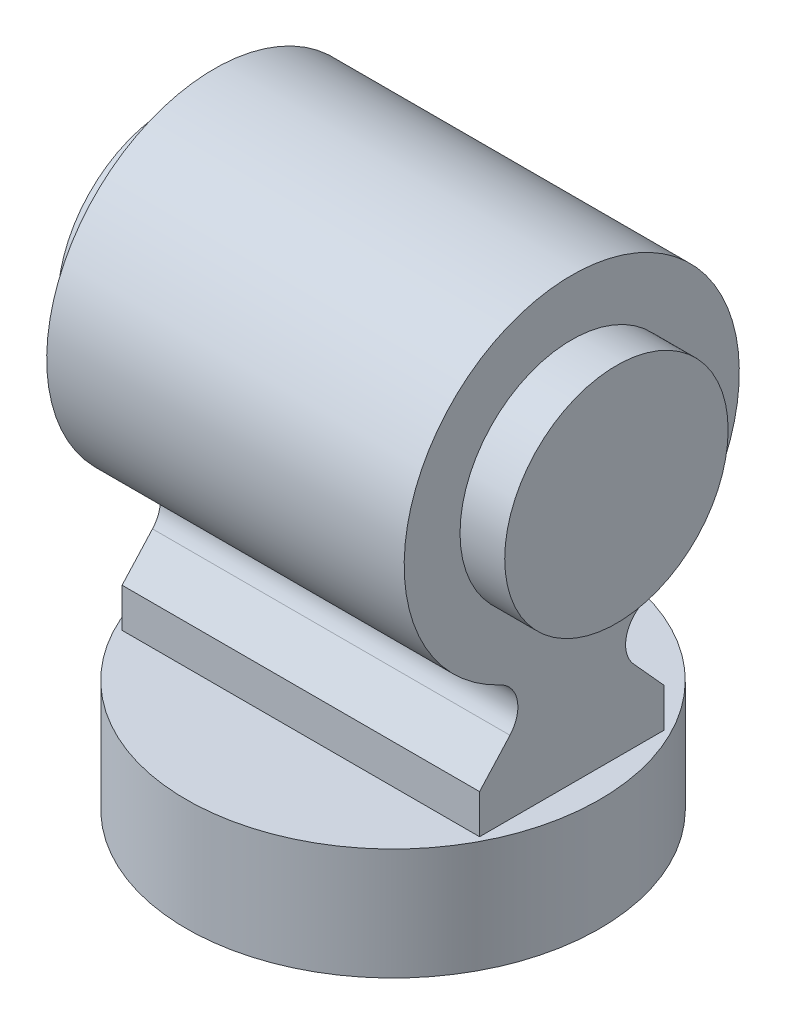
ISO-10303-21;
HEADER;
FILE_DESCRIPTION(('STEP AP214'),'2;1');
FILE_NAME('part.step','',(''),(''),'','','');
FILE_SCHEMA(('AUTOMOTIVE_DESIGN { 1 0 10303 214 1 1 1 1 }'));
ENDSEC;
DATA;
#1=APPLICATION_CONTEXT('core data for automotive mechanical design processes');
#2=APPLICATION_PROTOCOL_DEFINITION('international standard','automotive_design',2000,#1);
#3=PRODUCT_CONTEXT('',#1,'mechanical');
#4=PRODUCT('Part','Part','',(#3));
#5=PRODUCT_RELATED_PRODUCT_CATEGORY('part','',(#4));
#6=PRODUCT_DEFINITION_FORMATION('','',#4);
#7=PRODUCT_DEFINITION_CONTEXT('part definition',#1,'design');
#8=PRODUCT_DEFINITION('design','',#6,#7);
#9=PRODUCT_DEFINITION_SHAPE('','',#8);
#10=(LENGTH_UNIT() NAMED_UNIT(*) SI_UNIT(.MILLI.,.METRE.));
#11=(NAMED_UNIT(*) PLANE_ANGLE_UNIT() SI_UNIT($,.RADIAN.));
#12=(NAMED_UNIT(*) SI_UNIT($,.STERADIAN.) SOLID_ANGLE_UNIT());
#13=UNCERTAINTY_MEASURE_WITH_UNIT(LENGTH_MEASURE(1.E-05),#10,'distance_accuracy_value','');
#14=(GEOMETRIC_REPRESENTATION_CONTEXT(3) GLOBAL_UNCERTAINTY_ASSIGNED_CONTEXT((#13)) GLOBAL_UNIT_ASSIGNED_CONTEXT((#10,
#11,#12)) REPRESENTATION_CONTEXT('',''));
#15=CARTESIAN_POINT('',(0.,0.,0.));
#16=DIRECTION('',(0.,0.,1.));
#17=DIRECTION('',(1.,0.,0.));
#18=AXIS2_PLACEMENT_3D('',#15,#16,#17);
#19=CARTESIAN_POINT('',(-32.,-32.1160022418731,-15.15));
#20=DIRECTION('',(1.,0.,0.));
#21=DIRECTION('',(0.,0.,-1.));
#22=AXIS2_PLACEMENT_3D('',#19,#20,#21);
#23=CYLINDRICAL_SURFACE('',#22,5.51);
#24=DIRECTION('',(1.,0.,0.));
#25=VECTOR('',#24,1.);
#26=CARTESIAN_POINT('',(-32.,-27.132640587333,-12.7992114897212));
#27=LINE('',#26,#25);
#28=CARTESIAN_POINT('',(-32.,-27.132640587333,-12.7992114897212));
#29=VERTEX_POINT('',#28);
#30=CARTESIAN_POINT('',(32.,-27.132640587333,-12.7992114897212));
#31=VERTEX_POINT('',#30);
#32=EDGE_CURVE('E127',#29,#31,#27,.T.);
#33=ORIENTED_EDGE('',*,*,#32,.T.);
#34=CARTESIAN_POINT('',(32.,-32.1160022418731,-15.15));
#35=DIRECTION('',(-1.,0.,0.));
#36=DIRECTION('',(0.,0.,-1.));
#37=AXIS2_PLACEMENT_3D('',#34,#35,#36);
#38=CIRCLE('',#37,5.51);
#39=CARTESIAN_POINT('',(32.,-35.8064974081402,-11.0585032778017));
#40=VERTEX_POINT('',#39);
#41=EDGE_CURVE('E138',#40,#31,#38,.T.);
#42=ORIENTED_EDGE('',*,*,#41,.F.);
#43=DIRECTION('',(1.,0.,0.));
#44=VECTOR('',#43,1.);
#45=CARTESIAN_POINT('',(-32.,-35.8064974081402,-11.0585032778017));
#46=LINE('',#45,#44);
#47=CARTESIAN_POINT('',(-32.,-35.8064974081402,-11.0585032778017));
#48=VERTEX_POINT('',#47);
#49=EDGE_CURVE('E41',#48,#40,#46,.T.);
#50=ORIENTED_EDGE('',*,*,#49,.F.);
#51=CARTESIAN_POINT('',(-32.,-32.1160022418731,-15.15));
#52=DIRECTION('',(-1.,0.,0.));
#53=DIRECTION('',(0.,0.,-1.));
#54=AXIS2_PLACEMENT_3D('',#51,#52,#53);
#55=CIRCLE('',#54,5.51);
#56=EDGE_CURVE('E139',#48,#29,#55,.T.);
#57=ORIENTED_EDGE('',*,*,#56,.T.);
#58=EDGE_LOOP('',(#33,#42,#50,#57));
#59=FACE_BOUND('',#58,.T.);
#60=ADVANCED_FACE('F34',(#59),#23,.F.);
#61=CARTESIAN_POINT('',(-32.,-35.8064974081402,-11.0585032778017));
#62=DIRECTION('',(0.,0.670961371417795,-0.741492304791595));
#63=DIRECTION('',(0.,0.741492304791595,0.670961371417795));
#64=AXIS2_PLACEMENT_3D('',#61,#62,#63);
#65=PLANE('',#64);
#66=ORIENTED_EDGE('',*,*,#49,.T.);
#67=DIRECTION('',(0.,0.741492304791595,0.670961371417795));
#68=VECTOR('',#67,1.);
#69=CARTESIAN_POINT('',(32.,-35.8064974081402,-11.0585032778017));
#70=LINE('',#69,#68);
#71=CARTESIAN_POINT('',(32.,-41.82,-16.5));
#72=VERTEX_POINT('',#71);
#73=EDGE_CURVE('E153',#72,#40,#70,.T.);
#74=ORIENTED_EDGE('',*,*,#73,.F.);
#75=DIRECTION('',(1.,0.,0.));
#76=VECTOR('',#75,1.);
#77=CARTESIAN_POINT('',(-32.,-41.82,-16.5));
#78=LINE('',#77,#76);
#79=CARTESIAN_POINT('',(-32.,-41.82,-16.5));
#80=VERTEX_POINT('',#79);
#81=EDGE_CURVE('E55',#80,#72,#78,.T.);
#82=ORIENTED_EDGE('',*,*,#81,.F.);
#83=DIRECTION('',(0.,0.741492304791595,0.670961371417795));
#84=VECTOR('',#83,1.);
#85=CARTESIAN_POINT('',(-32.,-35.8064974081402,-11.0585032778017));
#86=LINE('',#85,#84);
#87=EDGE_CURVE('E105',#80,#48,#86,.T.);
#88=ORIENTED_EDGE('',*,*,#87,.T.);
#89=EDGE_LOOP('',(#66,#74,#82,#88));
#90=FACE_BOUND('',#89,.T.);
#91=ADVANCED_FACE('F195',(#90),#65,.T.);
#92=CARTESIAN_POINT('',(-32.,-41.82,-16.5));
#93=DIRECTION('',(0.,0.,-1.));
#94=DIRECTION('',(0.,1.,0.));
#95=AXIS2_PLACEMENT_3D('',#92,#93,#94);
#96=PLANE('',#95);
#97=ORIENTED_EDGE('',*,*,#81,.T.);
#98=DIRECTION('',(0.,1.,0.));
#99=VECTOR('',#98,1.);
#100=CARTESIAN_POINT('',(32.,-41.82,-16.5));
#101=LINE('',#100,#99);
#102=CARTESIAN_POINT('',(32.,-48.82,-16.5));
#103=VERTEX_POINT('',#102);
#104=EDGE_CURVE('E113',#103,#72,#101,.T.);
#105=ORIENTED_EDGE('',*,*,#104,.F.);
#106=DIRECTION('',(1.,0.,0.));
#107=VECTOR('',#106,1.);
#108=CARTESIAN_POINT('',(-32.,-48.82,-16.5));
#109=LINE('',#108,#107);
#110=CARTESIAN_POINT('',(-32.,-48.82,-16.5));
#111=VERTEX_POINT('',#110);
#112=EDGE_CURVE('E110',#111,#103,#109,.T.);
#113=ORIENTED_EDGE('',*,*,#112,.F.);
#114=DIRECTION('',(0.,1.,0.));
#115=VECTOR('',#114,1.);
#116=CARTESIAN_POINT('',(-32.,-41.82,-16.5));
#117=LINE('',#116,#115);
#118=EDGE_CURVE('E98',#111,#80,#117,.T.);
#119=ORIENTED_EDGE('',*,*,#118,.T.);
#120=EDGE_LOOP('',(#97,#105,#113,#119));
#121=FACE_BOUND('',#120,.T.);
#122=ADVANCED_FACE('F111',(#121),#96,.T.);
#123=CARTESIAN_POINT('',(-32.,-41.82,16.5));
#124=DIRECTION('',(0.,0.,1.));
#125=DIRECTION('',(0.,-1.,0.));
#126=AXIS2_PLACEMENT_3D('',#123,#124,#125);
#127=PLANE('',#126);
#128=DIRECTION('',(1.,0.,0.));
#129=VECTOR('',#128,1.);
#130=CARTESIAN_POINT('',(-32.,-48.82,16.5));
#131=LINE('',#130,#129);
#132=CARTESIAN_POINT('',(-32.,-48.82,16.5));
#133=VERTEX_POINT('',#132);
#134=CARTESIAN_POINT('',(32.,-48.82,16.5));
#135=VERTEX_POINT('',#134);
#136=EDGE_CURVE('E116',#133,#135,#131,.T.);
#137=ORIENTED_EDGE('',*,*,#136,.T.);
#138=DIRECTION('',(0.,-1.,0.));
#139=VECTOR('',#138,1.);
#140=CARTESIAN_POINT('',(32.,-41.82,16.5));
#141=LINE('',#140,#139);
#142=CARTESIAN_POINT('',(32.,-41.82,16.5));
#143=VERTEX_POINT('',#142);
#144=EDGE_CURVE('E165',#143,#135,#141,.T.);
#145=ORIENTED_EDGE('',*,*,#144,.F.);
#146=DIRECTION('',(1.,0.,0.));
#147=VECTOR('',#146,1.);
#148=CARTESIAN_POINT('',(-32.,-41.82,16.5));
#149=LINE('',#148,#147);
#150=CARTESIAN_POINT('',(-32.,-41.82,16.5));
#151=VERTEX_POINT('',#150);
#152=EDGE_CURVE('E131',#151,#143,#149,.T.);
#153=ORIENTED_EDGE('',*,*,#152,.F.);
#154=DIRECTION('',(0.,-1.,0.));
#155=VECTOR('',#154,1.);
#156=CARTESIAN_POINT('',(-32.,-41.82,16.5));
#157=LINE('',#156,#155);
#158=EDGE_CURVE('E120',#151,#133,#157,.T.);
#159=ORIENTED_EDGE('',*,*,#158,.T.);
#160=EDGE_LOOP('',(#137,#145,#153,#159));
#161=FACE_BOUND('',#160,.T.);
#162=ADVANCED_FACE('F187',(#161),#127,.T.);
#163=CARTESIAN_POINT('',(-32.,-35.8064974081402,11.0585032778017));
#164=DIRECTION('',(0.,0.670961371417795,0.741492304791595));
#165=DIRECTION('',(0.,-0.741492304791595,0.670961371417795));
#166=AXIS2_PLACEMENT_3D('',#163,#164,#165);
#167=PLANE('',#166);
#168=ORIENTED_EDGE('',*,*,#152,.T.);
#169=DIRECTION('',(0.,-0.741492304791595,0.670961371417795));
#170=VECTOR('',#169,1.);
#171=CARTESIAN_POINT('',(32.,-35.8064974081402,11.0585032778017));
#172=LINE('',#171,#170);
#173=CARTESIAN_POINT('',(32.,-35.8064974081402,11.0585032778017));
#174=VERTEX_POINT('',#173);
#175=EDGE_CURVE('E162',#174,#143,#172,.T.);
#176=ORIENTED_EDGE('',*,*,#175,.F.);
#177=DIRECTION('',(1.,0.,0.));
#178=VECTOR('',#177,1.);
#179=CARTESIAN_POINT('',(-32.,-35.8064974081402,11.0585032778017));
#180=LINE('',#179,#178);
#181=CARTESIAN_POINT('',(-32.,-35.8064974081402,11.0585032778017));
#182=VERTEX_POINT('',#181);
#183=EDGE_CURVE('E133',#182,#174,#180,.T.);
#184=ORIENTED_EDGE('',*,*,#183,.F.);
#185=DIRECTION('',(0.,-0.741492304791595,0.670961371417795));
#186=VECTOR('',#185,1.);
#187=CARTESIAN_POINT('',(-32.,-35.8064974081402,11.0585032778017));
#188=LINE('',#187,#186);
#189=EDGE_CURVE('E122',#182,#151,#188,.T.);
#190=ORIENTED_EDGE('',*,*,#189,.T.);
#191=EDGE_LOOP('',(#168,#176,#184,#190));
#192=FACE_BOUND('',#191,.T.);
#193=ADVANCED_FACE('F180',(#192),#167,.T.);
#194=CARTESIAN_POINT('',(-32.,-32.1160022418731,15.15));
#195=DIRECTION('',(1.,0.,0.));
#196=DIRECTION('',(0.,0.,-1.));
#197=AXIS2_PLACEMENT_3D('',#194,#195,#196);
#198=CYLINDRICAL_SURFACE('',#197,5.51);
#199=ORIENTED_EDGE('',*,*,#183,.T.);
#200=CARTESIAN_POINT('',(32.,-32.1160022418731,15.15));
#201=DIRECTION('',(-1.,0.,0.));
#202=DIRECTION('',(0.,0.,1.));
#203=AXIS2_PLACEMENT_3D('',#200,#201,#202);
#204=CIRCLE('',#203,5.51);
#205=CARTESIAN_POINT('',(32.,-27.132640587333,12.7992114897212));
#206=VERTEX_POINT('',#205);
#207=EDGE_CURVE('E149',#206,#174,#204,.T.);
#208=ORIENTED_EDGE('',*,*,#207,.F.);
#209=DIRECTION('',(1.,0.,0.));
#210=VECTOR('',#209,1.);
#211=CARTESIAN_POINT('',(-32.,-27.132640587333,12.7992114897212));
#212=LINE('',#211,#210);
#213=CARTESIAN_POINT('',(-32.,-27.132640587333,12.7992114897212));
#214=VERTEX_POINT('',#213);
#215=EDGE_CURVE('E135',#214,#206,#212,.T.);
#216=ORIENTED_EDGE('',*,*,#215,.F.);
#217=CARTESIAN_POINT('',(-32.,-32.1160022418731,15.15));
#218=DIRECTION('',(-1.,0.,0.));
#219=DIRECTION('',(0.,0.,1.));
#220=AXIS2_PLACEMENT_3D('',#217,#218,#219);
#221=CIRCLE('',#220,5.51);
#222=EDGE_CURVE('E175',#214,#182,#221,.T.);
#223=ORIENTED_EDGE('',*,*,#222,.T.);
#224=EDGE_LOOP('',(#199,#208,#216,#223));
#225=FACE_BOUND('',#224,.T.);
#226=ADVANCED_FACE('F184',(#225),#198,.F.);
#227=CARTESIAN_POINT('',(-32.,0.,0.));
#228=DIRECTION('',(1.,0.,0.));
#229=DIRECTION('',(0.,0.,-1.));
#230=AXIS2_PLACEMENT_3D('',#227,#228,#229);
#231=CYLINDRICAL_SURFACE('',#230,30.);
#232=ORIENTED_EDGE('',*,*,#215,.T.);
#233=CARTESIAN_POINT('',(32.,0.,0.));
#234=DIRECTION('',(1.,0.,0.));
#235=DIRECTION('',(0.,0.,-1.));
#236=AXIS2_PLACEMENT_3D('',#233,#234,#235);
#237=CIRCLE('',#236,30.);
#238=EDGE_CURVE('E144',#31,#206,#237,.T.);
#239=ORIENTED_EDGE('',*,*,#238,.F.);
#240=ORIENTED_EDGE('',*,*,#32,.F.);
#241=CARTESIAN_POINT('',(-32.,0.,0.));
#242=DIRECTION('',(1.,0.,0.));
#243=DIRECTION('',(0.,0.,-1.));
#244=AXIS2_PLACEMENT_3D('',#241,#242,#243);
#245=CIRCLE('',#244,30.);
#246=EDGE_CURVE('E173',#29,#214,#245,.T.);
#247=ORIENTED_EDGE('',*,*,#246,.T.);
#248=EDGE_LOOP('',(#232,#239,#240,#247));
#249=FACE_BOUND('',#248,.T.);
#250=ADVANCED_FACE('F145',(#249),#231,.T.);
#251=CARTESIAN_POINT('',(-32.,-32.1160022418731,-15.15));
#252=DIRECTION('',(1.,0.,0.));
#253=DIRECTION('',(0.,0.,-1.));
#254=AXIS2_PLACEMENT_3D('',#251,#252,#253);
#255=PLANE('',#254);
#256=CARTESIAN_POINT('',(-32.,0.,0.));
#257=DIRECTION('',(1.,0.,0.));
#258=DIRECTION('',(0.,0.,-1.));
#259=AXIS2_PLACEMENT_3D('',#256,#257,#258);
#260=CIRCLE('',#259,20.);
#261=CARTESIAN_POINT('',(-32.,0.,-20.));
#262=VERTEX_POINT('',#261);
#263=EDGE_CURVE('E11',#262,#262,#260,.F.);
#264=ORIENTED_EDGE('',*,*,#263,.F.);
#265=EDGE_LOOP('',(#264));
#266=FACE_BOUND('',#265,.T.);
#267=ORIENTED_EDGE('',*,*,#56,.F.);
#268=ORIENTED_EDGE('',*,*,#87,.F.);
#269=ORIENTED_EDGE('',*,*,#118,.F.);
#270=DIRECTION('',(0.,0.,-1.));
#271=VECTOR('',#270,1.);
#272=CARTESIAN_POINT('',(-32.,-48.82,-16.5));
#273=LINE('',#272,#271);
#274=EDGE_CURVE('E103',#133,#111,#273,.T.);
#275=ORIENTED_EDGE('',*,*,#274,.F.);
#276=ORIENTED_EDGE('',*,*,#158,.F.);
#277=ORIENTED_EDGE('',*,*,#189,.F.);
#278=ORIENTED_EDGE('',*,*,#222,.F.);
#279=ORIENTED_EDGE('',*,*,#246,.F.);
#280=EDGE_LOOP('',(#267,#268,#269,#275,#276,#277,#278,#279));
#281=FACE_BOUND('',#280,.T.);
#282=ADVANCED_FACE('F100',(#266,#281),#255,.F.);
#283=CARTESIAN_POINT('',(32.,-32.1160022418731,-15.15));
#284=DIRECTION('',(1.,0.,0.));
#285=DIRECTION('',(0.,0.,-1.));
#286=AXIS2_PLACEMENT_3D('',#283,#284,#285);
#287=PLANE('',#286);
#288=CARTESIAN_POINT('',(32.,0.,0.));
#289=DIRECTION('',(1.,0.,0.));
#290=DIRECTION('',(0.,0.,-1.));
#291=AXIS2_PLACEMENT_3D('',#288,#289,#290);
#292=CIRCLE('',#291,20.);
#293=CARTESIAN_POINT('',(32.,0.,-20.));
#294=VERTEX_POINT('',#293);
#295=EDGE_CURVE('E157',#294,#294,#292,.T.);
#296=ORIENTED_EDGE('',*,*,#295,.F.);
#297=EDGE_LOOP('',(#296));
#298=FACE_BOUND('',#297,.T.);
#299=ORIENTED_EDGE('',*,*,#41,.T.);
#300=ORIENTED_EDGE('',*,*,#238,.T.);
#301=ORIENTED_EDGE('',*,*,#207,.T.);
#302=ORIENTED_EDGE('',*,*,#175,.T.);
#303=ORIENTED_EDGE('',*,*,#144,.T.);
#304=DIRECTION('',(0.,0.,-1.));
#305=VECTOR('',#304,1.);
#306=CARTESIAN_POINT('',(32.,-48.82,-16.5));
#307=LINE('',#306,#305);
#308=EDGE_CURVE('E168',#135,#103,#307,.T.);
#309=ORIENTED_EDGE('',*,*,#308,.T.);
#310=ORIENTED_EDGE('',*,*,#104,.T.);
#311=ORIENTED_EDGE('',*,*,#73,.T.);
#312=EDGE_LOOP('',(#299,#300,#301,#302,#303,#309,#310,#311));
#313=FACE_BOUND('',#312,.T.);
#314=ADVANCED_FACE('F152',(#298,#313),#287,.T.);
#315=CARTESIAN_POINT('',(40.,0.,0.));
#316=DIRECTION('',(-1.,0.,0.));
#317=DIRECTION('',(0.,0.,1.));
#318=AXIS2_PLACEMENT_3D('',#315,#316,#317);
#319=CYLINDRICAL_SURFACE('',#318,20.);
#320=CARTESIAN_POINT('',(40.,0.,0.));
#321=DIRECTION('',(1.,0.,0.));
#322=DIRECTION('',(0.,0.,-1.));
#323=AXIS2_PLACEMENT_3D('',#320,#321,#322);
#324=CIRCLE('',#323,20.);
#325=CARTESIAN_POINT('',(40.,0.,-20.));
#326=VERTEX_POINT('',#325);
#327=EDGE_CURVE('E154',#326,#326,#324,.T.);
#328=ORIENTED_EDGE('',*,*,#327,.F.);
#329=EDGE_LOOP('',(#328));
#330=FACE_BOUND('',#329,.T.);
#331=ORIENTED_EDGE('',*,*,#295,.T.);
#332=EDGE_LOOP('',(#331));
#333=FACE_BOUND('',#332,.T.);
#334=ADVANCED_FACE('F210',(#330,#333),#319,.T.);
#335=CARTESIAN_POINT('',(40.,0.,0.));
#336=DIRECTION('',(1.,0.,0.));
#337=DIRECTION('',(0.,0.,-1.));
#338=AXIS2_PLACEMENT_3D('',#335,#336,#337);
#339=PLANE('',#338);
#340=ORIENTED_EDGE('',*,*,#327,.T.);
#341=EDGE_LOOP('',(#340));
#342=FACE_BOUND('',#341,.T.);
#343=ADVANCED_FACE('F214',(#342),#339,.T.);
#344=CARTESIAN_POINT('',(-40.,0.,0.));
#345=DIRECTION('',(1.,0.,0.));
#346=DIRECTION('',(0.,0.,-1.));
#347=AXIS2_PLACEMENT_3D('',#344,#345,#346);
#348=CYLINDRICAL_SURFACE('',#347,20.);
#349=CARTESIAN_POINT('',(-40.,0.,0.));
#350=DIRECTION('',(-1.,0.,0.));
#351=DIRECTION('',(0.,0.,1.));
#352=AXIS2_PLACEMENT_3D('',#349,#350,#351);
#353=CIRCLE('',#352,20.);
#354=CARTESIAN_POINT('',(-40.,0.,20.));
#355=VERTEX_POINT('',#354);
#356=EDGE_CURVE('E242',#355,#355,#353,.T.);
#357=ORIENTED_EDGE('',*,*,#356,.F.);
#358=EDGE_LOOP('',(#357));
#359=FACE_BOUND('',#358,.T.);
#360=ORIENTED_EDGE('',*,*,#263,.T.);
#361=EDGE_LOOP('',(#360));
#362=FACE_BOUND('',#361,.T.);
#363=ADVANCED_FACE('F218',(#359,#362),#348,.T.);
#364=CARTESIAN_POINT('',(-40.,0.,0.));
#365=DIRECTION('',(-1.,0.,0.));
#366=DIRECTION('',(0.,0.,1.));
#367=AXIS2_PLACEMENT_3D('',#364,#365,#366);
#368=PLANE('',#367);
#369=ORIENTED_EDGE('',*,*,#356,.T.);
#370=EDGE_LOOP('',(#369));
#371=FACE_BOUND('',#370,.T.);
#372=ADVANCED_FACE('F222',(#371),#368,.T.);
#373=CARTESIAN_POINT('',(0.,-48.82,0.));
#374=DIRECTION('',(0.,-1.,0.));
#375=DIRECTION('',(0.,0.,-1.));
#376=AXIS2_PLACEMENT_3D('',#373,#374,#375);
#377=PLANE('',#376);
#378=CARTESIAN_POINT('',(0.,-48.82,0.));
#379=DIRECTION('',(0.,-1.,0.));
#380=DIRECTION('',(0.,0.,-1.));
#381=AXIS2_PLACEMENT_3D('',#378,#379,#380);
#382=CIRCLE('',#381,37.);
#383=CARTESIAN_POINT('',(0.,-48.82,-37.));
#384=VERTEX_POINT('',#383);
#385=EDGE_CURVE('E243',#384,#384,#382,.T.);
#386=ORIENTED_EDGE('',*,*,#385,.F.);
#387=EDGE_LOOP('',(#386));
#388=FACE_BOUND('',#387,.T.);
#389=ORIENTED_EDGE('',*,*,#274,.T.);
#390=ORIENTED_EDGE('',*,*,#112,.T.);
#391=ORIENTED_EDGE('',*,*,#308,.F.);
#392=ORIENTED_EDGE('',*,*,#136,.F.);
#393=EDGE_LOOP('',(#389,#390,#391,#392));
#394=FACE_BOUND('',#393,.T.);
#395=ADVANCED_FACE('F119',(#388,#394),#377,.F.);
#396=CARTESIAN_POINT('',(0.,-68.82,0.));
#397=DIRECTION('',(0.,1.,0.));
#398=DIRECTION('',(0.,0.,1.));
#399=AXIS2_PLACEMENT_3D('',#396,#397,#398);
#400=CYLINDRICAL_SURFACE('',#399,37.);
#401=CARTESIAN_POINT('',(0.,-68.82,0.));
#402=DIRECTION('',(0.,-1.,0.));
#403=DIRECTION('',(0.,0.,-1.));
#404=AXIS2_PLACEMENT_3D('',#401,#402,#403);
#405=CIRCLE('',#404,37.);
#406=CARTESIAN_POINT('',(0.,-68.82,-37.));
#407=VERTEX_POINT('',#406);
#408=EDGE_CURVE('E241',#407,#407,#405,.T.);
#409=ORIENTED_EDGE('',*,*,#408,.F.);
#410=EDGE_LOOP('',(#409));
#411=FACE_BOUND('',#410,.T.);
#412=ORIENTED_EDGE('',*,*,#385,.T.);
#413=EDGE_LOOP('',(#412));
#414=FACE_BOUND('',#413,.T.);
#415=ADVANCED_FACE('F227',(#411,#414),#400,.T.);
#416=CARTESIAN_POINT('',(0.,-68.82,0.));
#417=DIRECTION('',(0.,-1.,0.));
#418=DIRECTION('',(0.,0.,-1.));
#419=AXIS2_PLACEMENT_3D('',#416,#417,#418);
#420=PLANE('',#419);
#421=ORIENTED_EDGE('',*,*,#408,.T.);
#422=EDGE_LOOP('',(#421));
#423=FACE_BOUND('',#422,.T.);
#424=ADVANCED_FACE('F230',(#423),#420,.T.);
#425=CLOSED_SHELL('',(#60,#91,#122,#162,#193,#226,#250,#282,#314,#334,#343,#363,#372,#395,#415,#424));
#426=MANIFOLD_SOLID_BREP('B2',#425);
#427=ADVANCED_BREP_SHAPE_REPRESENTATION('',(#18,#426),#14);
#428=SHAPE_DEFINITION_REPRESENTATION(#9,#427);
ENDSEC;
END-ISO-10303-21;
